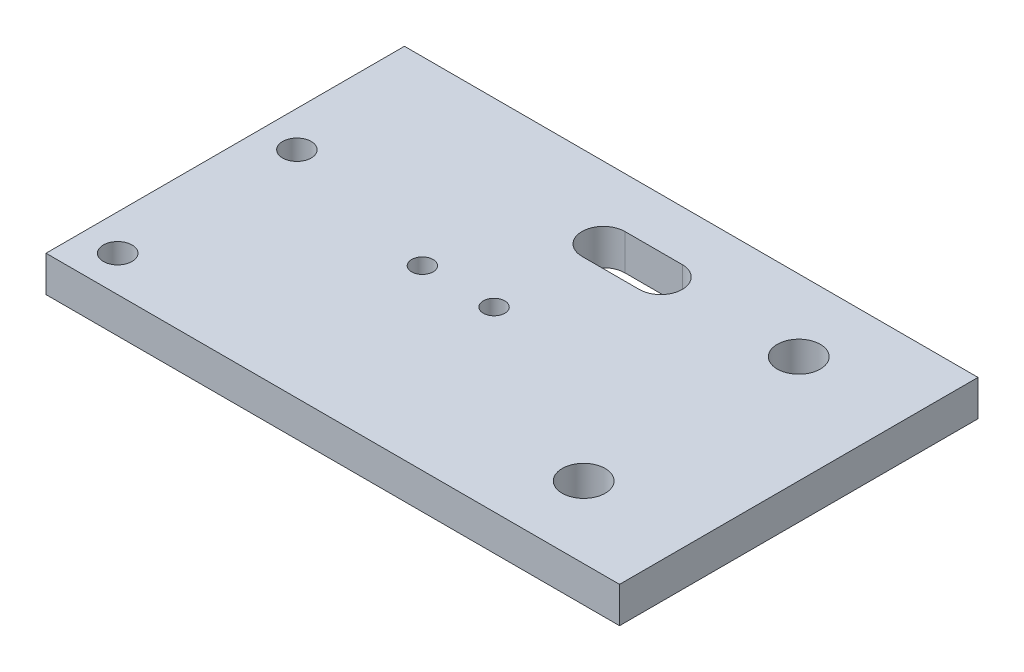
ISO-10303-21;
HEADER;
FILE_DESCRIPTION(('STEP AP214'),'2;1');
FILE_NAME('part.step','',(''),(''),'','','');
FILE_SCHEMA(('AUTOMOTIVE_DESIGN { 1 0 10303 214 1 1 1 1 }'));
ENDSEC;
DATA;
#1=APPLICATION_CONTEXT('core data for automotive mechanical design processes');
#2=APPLICATION_PROTOCOL_DEFINITION('international standard','automotive_design',2000,#1);
#3=PRODUCT_CONTEXT('',#1,'mechanical');
#4=PRODUCT('Part','Part','',(#3));
#5=PRODUCT_RELATED_PRODUCT_CATEGORY('part','',(#4));
#6=PRODUCT_DEFINITION_FORMATION('','',#4);
#7=PRODUCT_DEFINITION_CONTEXT('part definition',#1,'design');
#8=PRODUCT_DEFINITION('design','',#6,#7);
#9=PRODUCT_DEFINITION_SHAPE('','',#8);
#10=(LENGTH_UNIT() NAMED_UNIT(*) SI_UNIT(.MILLI.,.METRE.));
#11=(NAMED_UNIT(*) PLANE_ANGLE_UNIT() SI_UNIT($,.RADIAN.));
#12=(NAMED_UNIT(*) SI_UNIT($,.STERADIAN.) SOLID_ANGLE_UNIT());
#13=UNCERTAINTY_MEASURE_WITH_UNIT(LENGTH_MEASURE(1.E-05),#10,'distance_accuracy_value','');
#14=(GEOMETRIC_REPRESENTATION_CONTEXT(3) GLOBAL_UNCERTAINTY_ASSIGNED_CONTEXT((#13)) GLOBAL_UNIT_ASSIGNED_CONTEXT((#10,
#11,#12)) REPRESENTATION_CONTEXT('',''));
#15=CARTESIAN_POINT('',(0.,0.,0.));
#16=DIRECTION('',(0.,0.,1.));
#17=DIRECTION('',(1.,0.,0.));
#18=AXIS2_PLACEMENT_3D('',#15,#16,#17);
#19=CARTESIAN_POINT('',(0.,5.,0.));
#20=DIRECTION('',(0.,-1.,0.));
#21=DIRECTION('',(0.,0.,-1.));
#22=AXIS2_PLACEMENT_3D('',#19,#20,#21);
#23=PLANE('',#22);
#24=CARTESIAN_POINT('',(27.7526640817929,5.,-24.7436833979544));
#25=DIRECTION('',(0.,1.,0.));
#26=DIRECTION('',(0.,0.,1.));
#27=AXIS2_PLACEMENT_3D('',#24,#25,#26);
#28=CIRCLE('',#27,1.5);
#29=CARTESIAN_POINT('',(27.7526640817929,5.,-23.2436833979544));
#30=VERTEX_POINT('',#29);
#31=EDGE_CURVE('E183',#30,#30,#28,.T.);
#32=ORIENTED_EDGE('',*,*,#31,.F.);
#33=EDGE_LOOP('',(#32));
#34=FACE_BOUND('',#33,.T.);
#35=CARTESIAN_POINT('',(4.99999999999957,5.,-29.9999999999997));
#36=DIRECTION('',(0.,1.,0.));
#37=DIRECTION('',(0.,0.,1.));
#38=AXIS2_PLACEMENT_3D('',#35,#36,#37);
#39=CIRCLE('',#38,2.);
#40=CARTESIAN_POINT('',(4.99999999999957,5.,-27.9999999999997));
#41=VERTEX_POINT('',#40);
#42=EDGE_CURVE('E367',#41,#41,#39,.T.);
#43=ORIENTED_EDGE('',*,*,#42,.F.);
#44=EDGE_LOOP('',(#43));
#45=FACE_BOUND('',#44,.T.);
#46=CARTESIAN_POINT('',(4.99999999999931,5.,-4.99999999999974));
#47=DIRECTION('',(0.,1.,0.));
#48=DIRECTION('',(0.,0.,1.));
#49=AXIS2_PLACEMENT_3D('',#46,#47,#48);
#50=CIRCLE('',#49,2.);
#51=CARTESIAN_POINT('',(4.99999999999931,5.,-2.99999999999974));
#52=VERTEX_POINT('',#51);
#53=EDGE_CURVE('E370',#52,#52,#50,.T.);
#54=ORIENTED_EDGE('',*,*,#53,.F.);
#55=EDGE_LOOP('',(#54));
#56=FACE_BOUND('',#55,.T.);
#57=CARTESIAN_POINT('',(37.7526640817929,5.,-24.7436833979543));
#58=DIRECTION('',(0.,1.,0.));
#59=DIRECTION('',(0.,0.,1.));
#60=AXIS2_PLACEMENT_3D('',#57,#58,#59);
#61=CIRCLE('',#60,1.5);
#62=CARTESIAN_POINT('',(37.7526640817929,5.,-23.2436833979543));
#63=VERTEX_POINT('',#62);
#64=EDGE_CURVE('E124',#63,#63,#61,.T.);
#65=ORIENTED_EDGE('',*,*,#64,.F.);
#66=EDGE_LOOP('',(#65));
#67=FACE_BOUND('',#66,.T.);
#68=DIRECTION('',(1.,0.,0.));
#69=VECTOR('',#68,1.);
#70=CARTESIAN_POINT('',(37.7526640817929,5.,-37.));
#71=LINE('',#70,#69);
#72=CARTESIAN_POINT('',(37.7526640817929,5.,-37.));
#73=VERTEX_POINT('',#72);
#74=CARTESIAN_POINT('',(45.7526640817929,5.,-37.));
#75=VERTEX_POINT('',#74);
#76=EDGE_CURVE('E130',#73,#75,#71,.T.);
#77=ORIENTED_EDGE('',*,*,#76,.F.);
#78=CARTESIAN_POINT('',(37.7526640817929,5.,-40.));
#79=DIRECTION('',(0.,1.,0.));
#80=DIRECTION('',(0.,0.,1.));
#81=AXIS2_PLACEMENT_3D('',#78,#79,#80);
#82=CIRCLE('',#81,3.);
#83=CARTESIAN_POINT('',(37.7526640817929,5.,-43.));
#84=VERTEX_POINT('',#83);
#85=EDGE_CURVE('E50',#84,#73,#82,.T.);
#86=ORIENTED_EDGE('',*,*,#85,.F.);
#87=DIRECTION('',(1.,0.,0.));
#88=VECTOR('',#87,1.);
#89=CARTESIAN_POINT('',(37.7526640817929,5.,-43.));
#90=LINE('',#89,#88);
#91=CARTESIAN_POINT('',(45.7526640817929,5.,-43.));
#92=VERTEX_POINT('',#91);
#93=EDGE_CURVE('E118',#84,#92,#90,.T.);
#94=ORIENTED_EDGE('',*,*,#93,.T.);
#95=CARTESIAN_POINT('',(45.7526640817929,5.,-40.));
#96=DIRECTION('',(0.,1.,0.));
#97=DIRECTION('',(0.,0.,1.));
#98=AXIS2_PLACEMENT_3D('',#95,#96,#97);
#99=CIRCLE('',#98,3.);
#100=EDGE_CURVE('E121',#75,#92,#99,.T.);
#101=ORIENTED_EDGE('',*,*,#100,.F.);
#102=EDGE_LOOP('',(#77,#86,#94,#101));
#103=FACE_BOUND('',#102,.T.);
#104=DIRECTION('',(0.,0.,1.));
#105=VECTOR('',#104,1.);
#106=CARTESIAN_POINT('',(0.,5.,0.));
#107=LINE('',#106,#105);
#108=CARTESIAN_POINT('',(0.,5.,-50.));
#109=VERTEX_POINT('',#108);
#110=CARTESIAN_POINT('',(0.,5.,0.));
#111=VERTEX_POINT('',#110);
#112=EDGE_CURVE('E153',#109,#111,#107,.T.);
#113=ORIENTED_EDGE('',*,*,#112,.T.);
#114=DIRECTION('',(1.,0.,0.));
#115=VECTOR('',#114,1.);
#116=CARTESIAN_POINT('',(0.,5.,0.));
#117=LINE('',#116,#115);
#118=CARTESIAN_POINT('',(80.,5.,0.));
#119=VERTEX_POINT('',#118);
#120=EDGE_CURVE('E156',#111,#119,#117,.T.);
#121=ORIENTED_EDGE('',*,*,#120,.T.);
#122=DIRECTION('',(0.,0.,-1.));
#123=VECTOR('',#122,1.);
#124=CARTESIAN_POINT('',(80.,5.,0.));
#125=LINE('',#124,#123);
#126=CARTESIAN_POINT('',(80.,5.,-50.));
#127=VERTEX_POINT('',#126);
#128=EDGE_CURVE('E159',#119,#127,#125,.T.);
#129=ORIENTED_EDGE('',*,*,#128,.T.);
#130=DIRECTION('',(-1.,0.,0.));
#131=VECTOR('',#130,1.);
#132=CARTESIAN_POINT('',(0.,5.,-50.));
#133=LINE('',#132,#131);
#134=EDGE_CURVE('E161',#127,#109,#133,.T.);
#135=ORIENTED_EDGE('',*,*,#134,.T.);
#136=EDGE_LOOP('',(#113,#121,#129,#135));
#137=FACE_BOUND('',#136,.T.);
#138=CARTESIAN_POINT('',(65.,5.,-10.));
#139=DIRECTION('',(0.,1.,0.));
#140=DIRECTION('',(0.,0.,1.));
#141=AXIS2_PLACEMENT_3D('',#138,#139,#140);
#142=CIRCLE('',#141,3.00000000000001);
#143=CARTESIAN_POINT('',(65.,5.,-6.99999999999999));
#144=VERTEX_POINT('',#143);
#145=EDGE_CURVE('E147',#144,#144,#142,.T.);
#146=ORIENTED_EDGE('',*,*,#145,.F.);
#147=EDGE_LOOP('',(#146));
#148=FACE_BOUND('',#147,.T.);
#149=CARTESIAN_POINT('',(65.,5.,-40.));
#150=DIRECTION('',(0.,1.,0.));
#151=DIRECTION('',(0.,0.,1.));
#152=AXIS2_PLACEMENT_3D('',#149,#150,#151);
#153=CIRCLE('',#152,3.00000000000001);
#154=CARTESIAN_POINT('',(65.,5.,-37.));
#155=VERTEX_POINT('',#154);
#156=EDGE_CURVE('E141',#155,#155,#153,.T.);
#157=ORIENTED_EDGE('',*,*,#156,.F.);
#158=EDGE_LOOP('',(#157));
#159=FACE_BOUND('',#158,.T.);
#160=ADVANCED_FACE('F33',(#34,#45,#56,#67,#103,#137,#148,#159),#23,.F.);
#161=CARTESIAN_POINT('',(0.,0.,0.));
#162=DIRECTION('',(0.,-1.,0.));
#163=DIRECTION('',(0.,0.,-1.));
#164=AXIS2_PLACEMENT_3D('',#161,#162,#163);
#165=PLANE('',#164);
#166=CARTESIAN_POINT('',(27.7526640817929,0.,-24.7436833979544));
#167=DIRECTION('',(0.,-1.,0.));
#168=DIRECTION('',(0.,0.,-1.));
#169=AXIS2_PLACEMENT_3D('',#166,#167,#168);
#170=CIRCLE('',#169,1.5);
#171=CARTESIAN_POINT('',(27.7526640817929,0.,-26.2436833979544));
#172=VERTEX_POINT('',#171);
#173=EDGE_CURVE('E37',#172,#172,#170,.T.);
#174=ORIENTED_EDGE('',*,*,#173,.F.);
#175=EDGE_LOOP('',(#174));
#176=FACE_BOUND('',#175,.T.);
#177=CARTESIAN_POINT('',(4.99999999999957,0.,-29.9999999999997));
#178=DIRECTION('',(0.,-1.,0.));
#179=DIRECTION('',(0.,0.,-1.));
#180=AXIS2_PLACEMENT_3D('',#177,#178,#179);
#181=CIRCLE('',#180,2.);
#182=CARTESIAN_POINT('',(4.99999999999957,0.,-31.9999999999997));
#183=VERTEX_POINT('',#182);
#184=EDGE_CURVE('E182',#183,#183,#181,.T.);
#185=ORIENTED_EDGE('',*,*,#184,.F.);
#186=EDGE_LOOP('',(#185));
#187=FACE_BOUND('',#186,.T.);
#188=CARTESIAN_POINT('',(4.99999999999931,0.,-4.99999999999974));
#189=DIRECTION('',(0.,-1.,0.));
#190=DIRECTION('',(0.,0.,-1.));
#191=AXIS2_PLACEMENT_3D('',#188,#189,#190);
#192=CIRCLE('',#191,2.);
#193=CARTESIAN_POINT('',(4.99999999999931,0.,-6.99999999999974));
#194=VERTEX_POINT('',#193);
#195=EDGE_CURVE('E180',#194,#194,#192,.T.);
#196=ORIENTED_EDGE('',*,*,#195,.F.);
#197=EDGE_LOOP('',(#196));
#198=FACE_BOUND('',#197,.T.);
#199=CARTESIAN_POINT('',(37.7526640817929,0.,-24.7436833979543));
#200=DIRECTION('',(0.,-1.,0.));
#201=DIRECTION('',(0.,0.,-1.));
#202=AXIS2_PLACEMENT_3D('',#199,#200,#201);
#203=CIRCLE('',#202,1.5);
#204=CARTESIAN_POINT('',(37.7526640817929,0.,-26.2436833979543));
#205=VERTEX_POINT('',#204);
#206=EDGE_CURVE('E131',#205,#205,#203,.T.);
#207=ORIENTED_EDGE('',*,*,#206,.F.);
#208=EDGE_LOOP('',(#207));
#209=FACE_BOUND('',#208,.T.);
#210=CARTESIAN_POINT('',(37.7526640817929,0.,-40.));
#211=DIRECTION('',(0.,1.,0.));
#212=DIRECTION('',(0.,0.,1.));
#213=AXIS2_PLACEMENT_3D('',#210,#211,#212);
#214=CIRCLE('',#213,3.);
#215=CARTESIAN_POINT('',(37.7526640817929,0.,-43.));
#216=VERTEX_POINT('',#215);
#217=CARTESIAN_POINT('',(37.7526640817929,0.,-37.));
#218=VERTEX_POINT('',#217);
#219=EDGE_CURVE('E103',#216,#218,#214,.T.);
#220=ORIENTED_EDGE('',*,*,#219,.T.);
#221=DIRECTION('',(1.,0.,0.));
#222=VECTOR('',#221,1.);
#223=CARTESIAN_POINT('',(37.7526640817929,0.,-37.));
#224=LINE('',#223,#222);
#225=CARTESIAN_POINT('',(45.7526640817929,0.,-37.));
#226=VERTEX_POINT('',#225);
#227=EDGE_CURVE('E112',#218,#226,#224,.T.);
#228=ORIENTED_EDGE('',*,*,#227,.T.);
#229=CARTESIAN_POINT('',(45.7526640817929,0.,-40.));
#230=DIRECTION('',(0.,1.,0.));
#231=DIRECTION('',(0.,0.,1.));
#232=AXIS2_PLACEMENT_3D('',#229,#230,#231);
#233=CIRCLE('',#232,3.);
#234=CARTESIAN_POINT('',(45.7526640817929,0.,-43.));
#235=VERTEX_POINT('',#234);
#236=EDGE_CURVE('E58',#226,#235,#233,.T.);
#237=ORIENTED_EDGE('',*,*,#236,.T.);
#238=DIRECTION('',(1.,0.,0.));
#239=VECTOR('',#238,1.);
#240=CARTESIAN_POINT('',(37.7526640817929,0.,-43.));
#241=LINE('',#240,#239);
#242=EDGE_CURVE('E109',#216,#235,#241,.T.);
#243=ORIENTED_EDGE('',*,*,#242,.F.);
#244=EDGE_LOOP('',(#220,#228,#237,#243));
#245=FACE_BOUND('',#244,.T.);
#246=CARTESIAN_POINT('',(65.,0.,-10.));
#247=DIRECTION('',(0.,1.,0.));
#248=DIRECTION('',(0.,0.,1.));
#249=AXIS2_PLACEMENT_3D('',#246,#247,#248);
#250=CIRCLE('',#249,3.00000000000001);
#251=CARTESIAN_POINT('',(65.,0.,-6.99999999999999));
#252=VERTEX_POINT('',#251);
#253=EDGE_CURVE('E144',#252,#252,#250,.T.);
#254=ORIENTED_EDGE('',*,*,#253,.T.);
#255=EDGE_LOOP('',(#254));
#256=FACE_BOUND('',#255,.T.);
#257=DIRECTION('',(0.,0.,1.));
#258=VECTOR('',#257,1.);
#259=CARTESIAN_POINT('',(0.,0.,0.));
#260=LINE('',#259,#258);
#261=CARTESIAN_POINT('',(0.,0.,-50.));
#262=VERTEX_POINT('',#261);
#263=CARTESIAN_POINT('',(0.,0.,0.));
#264=VERTEX_POINT('',#263);
#265=EDGE_CURVE('E150',#262,#264,#260,.T.);
#266=ORIENTED_EDGE('',*,*,#265,.F.);
#267=DIRECTION('',(-1.,0.,0.));
#268=VECTOR('',#267,1.);
#269=CARTESIAN_POINT('',(0.,0.,-50.));
#270=LINE('',#269,#268);
#271=CARTESIAN_POINT('',(80.,0.,-50.));
#272=VERTEX_POINT('',#271);
#273=EDGE_CURVE('E157',#272,#262,#270,.T.);
#274=ORIENTED_EDGE('',*,*,#273,.F.);
#275=DIRECTION('',(0.,0.,-1.));
#276=VECTOR('',#275,1.);
#277=CARTESIAN_POINT('',(80.,0.,0.));
#278=LINE('',#277,#276);
#279=CARTESIAN_POINT('',(80.,0.,0.));
#280=VERTEX_POINT('',#279);
#281=EDGE_CURVE('E168',#280,#272,#278,.T.);
#282=ORIENTED_EDGE('',*,*,#281,.F.);
#283=DIRECTION('',(1.,0.,0.));
#284=VECTOR('',#283,1.);
#285=CARTESIAN_POINT('',(0.,0.,0.));
#286=LINE('',#285,#284);
#287=EDGE_CURVE('E166',#264,#280,#286,.T.);
#288=ORIENTED_EDGE('',*,*,#287,.F.);
#289=EDGE_LOOP('',(#266,#274,#282,#288));
#290=FACE_BOUND('',#289,.T.);
#291=CARTESIAN_POINT('',(65.,0.,-40.));
#292=DIRECTION('',(0.,1.,0.));
#293=DIRECTION('',(0.,0.,1.));
#294=AXIS2_PLACEMENT_3D('',#291,#292,#293);
#295=CIRCLE('',#294,3.00000000000001);
#296=CARTESIAN_POINT('',(65.,0.,-37.));
#297=VERTEX_POINT('',#296);
#298=EDGE_CURVE('E137',#297,#297,#295,.T.);
#299=ORIENTED_EDGE('',*,*,#298,.T.);
#300=EDGE_LOOP('',(#299));
#301=FACE_BOUND('',#300,.T.);
#302=ADVANCED_FACE('F116',(#176,#187,#198,#209,#245,#256,#290,#301),#165,.T.);
#303=CARTESIAN_POINT('',(0.,5.,0.));
#304=DIRECTION('',(1.,0.,0.));
#305=DIRECTION('',(0.,0.,-1.));
#306=AXIS2_PLACEMENT_3D('',#303,#304,#305);
#307=PLANE('',#306);
#308=ORIENTED_EDGE('',*,*,#265,.T.);
#309=DIRECTION('',(0.,-1.,0.));
#310=VECTOR('',#309,1.);
#311=CARTESIAN_POINT('',(0.,5.,0.));
#312=LINE('',#311,#310);
#313=EDGE_CURVE('E11',#111,#264,#312,.T.);
#314=ORIENTED_EDGE('',*,*,#313,.F.);
#315=ORIENTED_EDGE('',*,*,#112,.F.);
#316=DIRECTION('',(0.,-1.,0.));
#317=VECTOR('',#316,1.);
#318=CARTESIAN_POINT('',(0.,5.,-50.));
#319=LINE('',#318,#317);
#320=EDGE_CURVE('E163',#109,#262,#319,.T.);
#321=ORIENTED_EDGE('',*,*,#320,.T.);
#322=EDGE_LOOP('',(#308,#314,#315,#321));
#323=FACE_BOUND('',#322,.T.);
#324=ADVANCED_FACE('F35',(#323),#307,.F.);
#325=CARTESIAN_POINT('',(0.,5.,0.));
#326=DIRECTION('',(0.,0.,-1.));
#327=DIRECTION('',(-1.,0.,0.));
#328=AXIS2_PLACEMENT_3D('',#325,#326,#327);
#329=PLANE('',#328);
#330=ORIENTED_EDGE('',*,*,#287,.T.);
#331=DIRECTION('',(0.,-1.,0.));
#332=VECTOR('',#331,1.);
#333=CARTESIAN_POINT('',(80.,5.,0.));
#334=LINE('',#333,#332);
#335=EDGE_CURVE('E42',#119,#280,#334,.T.);
#336=ORIENTED_EDGE('',*,*,#335,.F.);
#337=ORIENTED_EDGE('',*,*,#120,.F.);
#338=ORIENTED_EDGE('',*,*,#313,.T.);
#339=EDGE_LOOP('',(#330,#336,#337,#338));
#340=FACE_BOUND('',#339,.T.);
#341=ADVANCED_FACE('F222',(#340),#329,.F.);
#342=CARTESIAN_POINT('',(80.,5.,0.));
#343=DIRECTION('',(-1.,0.,0.));
#344=DIRECTION('',(0.,0.,1.));
#345=AXIS2_PLACEMENT_3D('',#342,#343,#344);
#346=PLANE('',#345);
#347=ORIENTED_EDGE('',*,*,#281,.T.);
#348=DIRECTION('',(0.,-1.,0.));
#349=VECTOR('',#348,1.);
#350=CARTESIAN_POINT('',(80.,5.,-50.));
#351=LINE('',#350,#349);
#352=EDGE_CURVE('E173',#127,#272,#351,.T.);
#353=ORIENTED_EDGE('',*,*,#352,.F.);
#354=ORIENTED_EDGE('',*,*,#128,.F.);
#355=ORIENTED_EDGE('',*,*,#335,.T.);
#356=EDGE_LOOP('',(#347,#353,#354,#355));
#357=FACE_BOUND('',#356,.T.);
#358=ADVANCED_FACE('F230',(#357),#346,.F.);
#359=CARTESIAN_POINT('',(0.,5.,-50.));
#360=DIRECTION('',(0.,0.,1.));
#361=DIRECTION('',(1.,0.,0.));
#362=AXIS2_PLACEMENT_3D('',#359,#360,#361);
#363=PLANE('',#362);
#364=ORIENTED_EDGE('',*,*,#273,.T.);
#365=ORIENTED_EDGE('',*,*,#320,.F.);
#366=ORIENTED_EDGE('',*,*,#134,.F.);
#367=ORIENTED_EDGE('',*,*,#352,.T.);
#368=EDGE_LOOP('',(#364,#365,#366,#367));
#369=FACE_BOUND('',#368,.T.);
#370=ADVANCED_FACE('F227',(#369),#363,.F.);
#371=CARTESIAN_POINT('',(65.,5.,-10.));
#372=DIRECTION('',(0.,-1.,0.));
#373=DIRECTION('',(0.,0.,-1.));
#374=AXIS2_PLACEMENT_3D('',#371,#372,#373);
#375=CYLINDRICAL_SURFACE('',#374,3.00000000000001);
#376=ORIENTED_EDGE('',*,*,#145,.T.);
#377=EDGE_LOOP('',(#376));
#378=FACE_BOUND('',#377,.T.);
#379=ORIENTED_EDGE('',*,*,#253,.F.);
#380=EDGE_LOOP('',(#379));
#381=FACE_BOUND('',#380,.T.);
#382=ADVANCED_FACE('F211',(#378,#381),#375,.F.);
#383=CARTESIAN_POINT('',(65.,5.,-40.));
#384=DIRECTION('',(0.,-1.,0.));
#385=DIRECTION('',(0.,0.,-1.));
#386=AXIS2_PLACEMENT_3D('',#383,#384,#385);
#387=CYLINDRICAL_SURFACE('',#386,3.00000000000001);
#388=ORIENTED_EDGE('',*,*,#156,.T.);
#389=EDGE_LOOP('',(#388));
#390=FACE_BOUND('',#389,.T.);
#391=ORIENTED_EDGE('',*,*,#298,.F.);
#392=EDGE_LOOP('',(#391));
#393=FACE_BOUND('',#392,.T.);
#394=ADVANCED_FACE('F208',(#390,#393),#387,.F.);
#395=CARTESIAN_POINT('',(37.7526640817929,0.,-40.));
#396=DIRECTION('',(0.,1.,0.));
#397=DIRECTION('',(0.,0.,1.));
#398=AXIS2_PLACEMENT_3D('',#395,#396,#397);
#399=CYLINDRICAL_SURFACE('',#398,3.);
#400=ORIENTED_EDGE('',*,*,#85,.T.);
#401=DIRECTION('',(0.,1.,0.));
#402=VECTOR('',#401,1.);
#403=CARTESIAN_POINT('',(37.7526640817929,0.,-37.));
#404=LINE('',#403,#402);
#405=EDGE_CURVE('E99',#218,#73,#404,.T.);
#406=ORIENTED_EDGE('',*,*,#405,.F.);
#407=ORIENTED_EDGE('',*,*,#219,.F.);
#408=DIRECTION('',(0.,1.,0.));
#409=VECTOR('',#408,1.);
#410=CARTESIAN_POINT('',(37.7526640817929,0.,-43.));
#411=LINE('',#410,#409);
#412=EDGE_CURVE('E135',#216,#84,#411,.T.);
#413=ORIENTED_EDGE('',*,*,#412,.T.);
#414=EDGE_LOOP('',(#400,#406,#407,#413));
#415=FACE_BOUND('',#414,.T.);
#416=ADVANCED_FACE('F101',(#415),#399,.F.);
#417=CARTESIAN_POINT('',(37.7526640817929,0.,-43.));
#418=DIRECTION('',(0.,0.,1.));
#419=DIRECTION('',(1.,0.,0.));
#420=AXIS2_PLACEMENT_3D('',#417,#418,#419);
#421=PLANE('',#420);
#422=ORIENTED_EDGE('',*,*,#93,.F.);
#423=ORIENTED_EDGE('',*,*,#412,.F.);
#424=ORIENTED_EDGE('',*,*,#242,.T.);
#425=DIRECTION('',(0.,1.,0.));
#426=VECTOR('',#425,1.);
#427=CARTESIAN_POINT('',(45.7526640817929,0.,-43.));
#428=LINE('',#427,#426);
#429=EDGE_CURVE('E138',#235,#92,#428,.T.);
#430=ORIENTED_EDGE('',*,*,#429,.T.);
#431=EDGE_LOOP('',(#422,#423,#424,#430));
#432=FACE_BOUND('',#431,.T.);
#433=ADVANCED_FACE('F273',(#432),#421,.T.);
#434=CARTESIAN_POINT('',(45.7526640817929,0.,-40.));
#435=DIRECTION('',(0.,1.,0.));
#436=DIRECTION('',(0.,0.,1.));
#437=AXIS2_PLACEMENT_3D('',#434,#435,#436);
#438=CYLINDRICAL_SURFACE('',#437,3.);
#439=ORIENTED_EDGE('',*,*,#100,.T.);
#440=ORIENTED_EDGE('',*,*,#429,.F.);
#441=ORIENTED_EDGE('',*,*,#236,.F.);
#442=DIRECTION('',(0.,1.,0.));
#443=VECTOR('',#442,1.);
#444=CARTESIAN_POINT('',(45.7526640817929,0.,-37.));
#445=LINE('',#444,#443);
#446=EDGE_CURVE('E108',#226,#75,#445,.T.);
#447=ORIENTED_EDGE('',*,*,#446,.T.);
#448=EDGE_LOOP('',(#439,#440,#441,#447));
#449=FACE_BOUND('',#448,.T.);
#450=ADVANCED_FACE('F280',(#449),#438,.F.);
#451=CARTESIAN_POINT('',(37.7526640817929,0.,-37.));
#452=DIRECTION('',(0.,0.,1.));
#453=DIRECTION('',(1.,0.,0.));
#454=AXIS2_PLACEMENT_3D('',#451,#452,#453);
#455=PLANE('',#454);
#456=ORIENTED_EDGE('',*,*,#76,.T.);
#457=ORIENTED_EDGE('',*,*,#446,.F.);
#458=ORIENTED_EDGE('',*,*,#227,.F.);
#459=ORIENTED_EDGE('',*,*,#405,.T.);
#460=EDGE_LOOP('',(#456,#457,#458,#459));
#461=FACE_BOUND('',#460,.T.);
#462=ADVANCED_FACE('F113',(#461),#455,.F.);
#463=CARTESIAN_POINT('',(37.7526640817929,-5.,-24.7436833979543));
#464=DIRECTION('',(0.,1.,0.));
#465=DIRECTION('',(0.,0.,1.));
#466=AXIS2_PLACEMENT_3D('',#463,#464,#465);
#467=CYLINDRICAL_SURFACE('',#466,1.5);
#468=ORIENTED_EDGE('',*,*,#206,.T.);
#469=EDGE_LOOP('',(#468));
#470=FACE_BOUND('',#469,.T.);
#471=ORIENTED_EDGE('',*,*,#64,.T.);
#472=EDGE_LOOP('',(#471));
#473=FACE_BOUND('',#472,.T.);
#474=ADVANCED_FACE('F193',(#470,#473),#467,.F.);
#475=CARTESIAN_POINT('',(4.99999999999931,-5.,-4.99999999999974));
#476=DIRECTION('',(0.,1.,0.));
#477=DIRECTION('',(0.,0.,1.));
#478=AXIS2_PLACEMENT_3D('',#475,#476,#477);
#479=CYLINDRICAL_SURFACE('',#478,2.);
#480=ORIENTED_EDGE('',*,*,#195,.T.);
#481=EDGE_LOOP('',(#480));
#482=FACE_BOUND('',#481,.T.);
#483=ORIENTED_EDGE('',*,*,#53,.T.);
#484=EDGE_LOOP('',(#483));
#485=FACE_BOUND('',#484,.T.);
#486=ADVANCED_FACE('F299',(#482,#485),#479,.F.);
#487=CARTESIAN_POINT('',(4.99999999999957,-5.,-29.9999999999997));
#488=DIRECTION('',(0.,1.,0.));
#489=DIRECTION('',(0.,0.,1.));
#490=AXIS2_PLACEMENT_3D('',#487,#488,#489);
#491=CYLINDRICAL_SURFACE('',#490,2.);
#492=ORIENTED_EDGE('',*,*,#184,.T.);
#493=EDGE_LOOP('',(#492));
#494=FACE_BOUND('',#493,.T.);
#495=ORIENTED_EDGE('',*,*,#42,.T.);
#496=EDGE_LOOP('',(#495));
#497=FACE_BOUND('',#496,.T.);
#498=ADVANCED_FACE('F307',(#494,#497),#491,.F.);
#499=CARTESIAN_POINT('',(27.7526640817929,-5.,-24.7436833979544));
#500=DIRECTION('',(0.,1.,0.));
#501=DIRECTION('',(0.,0.,1.));
#502=AXIS2_PLACEMENT_3D('',#499,#500,#501);
#503=CYLINDRICAL_SURFACE('',#502,1.5);
#504=ORIENTED_EDGE('',*,*,#173,.T.);
#505=EDGE_LOOP('',(#504));
#506=FACE_BOUND('',#505,.T.);
#507=ORIENTED_EDGE('',*,*,#31,.T.);
#508=EDGE_LOOP('',(#507));
#509=FACE_BOUND('',#508,.T.);
#510=ADVANCED_FACE('F315',(#506,#509),#503,.F.);
#511=CLOSED_SHELL('',(#160,#302,#324,#341,#358,#370,#382,#394,#416,#433,#450,#462,#474,#486,
#498,#510));
#512=MANIFOLD_SOLID_BREP('B2',#511);
#513=ADVANCED_BREP_SHAPE_REPRESENTATION('',(#18,#512),#14);
#514=SHAPE_DEFINITION_REPRESENTATION(#9,#513);
ENDSEC;
END-ISO-10303-21;
